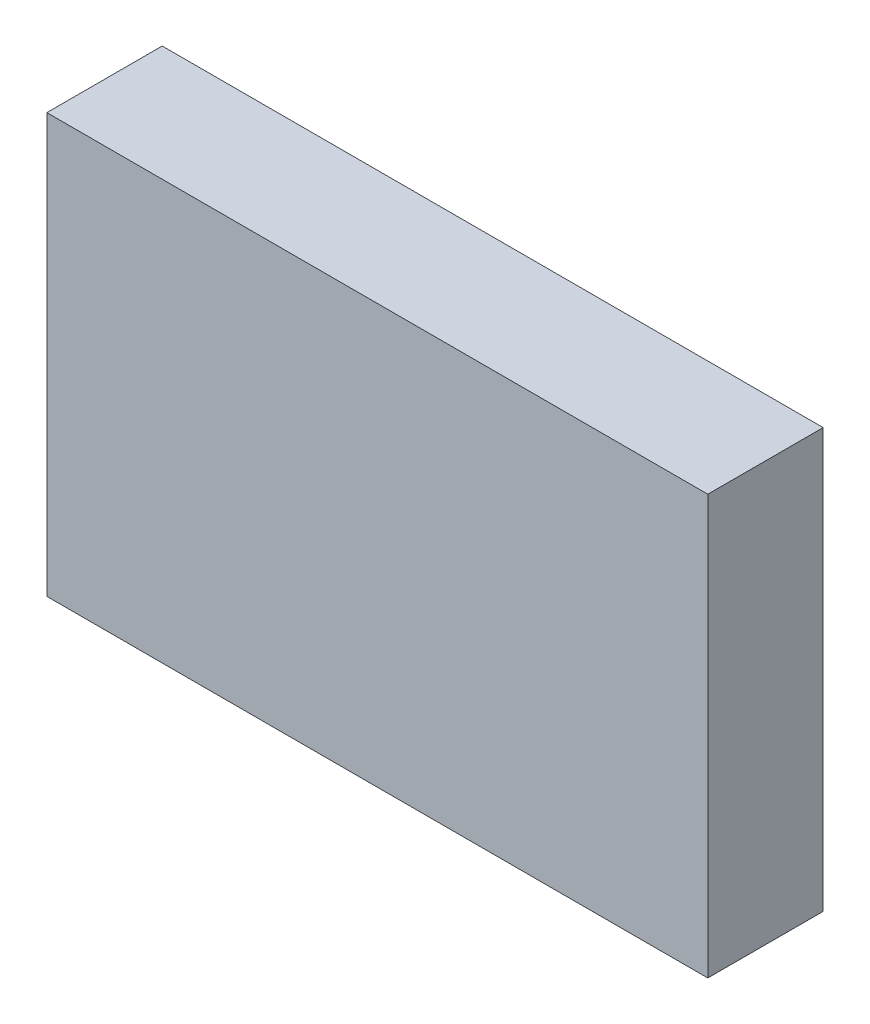
ISO-10303-21;
HEADER;
FILE_DESCRIPTION(('STEP AP214'),'2;1');
FILE_NAME('part.step','',(''),(''),'','','');
FILE_SCHEMA(('AUTOMOTIVE_DESIGN { 1 0 10303 214 1 1 1 1 }'));
ENDSEC;
DATA;
#1=APPLICATION_CONTEXT('core data for automotive mechanical design processes');
#2=APPLICATION_PROTOCOL_DEFINITION('international standard','automotive_design',2000,#1);
#3=PRODUCT_CONTEXT('',#1,'mechanical');
#4=PRODUCT('Part','Part','',(#3));
#5=PRODUCT_RELATED_PRODUCT_CATEGORY('part','',(#4));
#6=PRODUCT_DEFINITION_FORMATION('','',#4);
#7=PRODUCT_DEFINITION_CONTEXT('part definition',#1,'design');
#8=PRODUCT_DEFINITION('design','',#6,#7);
#9=PRODUCT_DEFINITION_SHAPE('','',#8);
#10=(LENGTH_UNIT() NAMED_UNIT(*) SI_UNIT(.MILLI.,.METRE.));
#11=(NAMED_UNIT(*) PLANE_ANGLE_UNIT() SI_UNIT($,.RADIAN.));
#12=(NAMED_UNIT(*) SI_UNIT($,.STERADIAN.) SOLID_ANGLE_UNIT());
#13=UNCERTAINTY_MEASURE_WITH_UNIT(LENGTH_MEASURE(1.E-05),#10,'distance_accuracy_value','');
#14=(GEOMETRIC_REPRESENTATION_CONTEXT(3) GLOBAL_UNCERTAINTY_ASSIGNED_CONTEXT((#13)) GLOBAL_UNIT_ASSIGNED_CONTEXT((#10,
#11,#12)) REPRESENTATION_CONTEXT('',''));
#15=CARTESIAN_POINT('',(0.,0.,0.));
#16=DIRECTION('',(0.,0.,1.));
#17=DIRECTION('',(1.,0.,0.));
#18=AXIS2_PLACEMENT_3D('',#15,#16,#17);
#19=CARTESIAN_POINT('',(7.62634736702007,17.020510715502,1.7018));
#20=DIRECTION('',(-1.,0.,0.));
#21=DIRECTION('',(0.,0.,1.));
#22=AXIS2_PLACEMENT_3D('',#19,#20,#21);
#23=PLANE('',#22);
#24=DIRECTION('',(0.,1.,0.));
#25=VECTOR('',#24,1.);
#26=CARTESIAN_POINT('',(7.62634736702007,16.294183696783,1.7018));
#27=LINE('',#26,#25);
#28=CARTESIAN_POINT('',(7.62634736702007,16.294183696783,1.7018));
#29=VERTEX_POINT('',#28);
#30=CARTESIAN_POINT('',(7.62634736702007,17.020510715502,1.7018));
#31=VERTEX_POINT('',#30);
#32=EDGE_CURVE('E95',#29,#31,#27,.T.);
#33=ORIENTED_EDGE('',*,*,#32,.F.);
#34=DIRECTION('',(0.,0.,1.));
#35=VECTOR('',#34,1.);
#36=CARTESIAN_POINT('',(7.62634736702007,16.294183696783,1.7018));
#37=LINE('',#36,#35);
#38=CARTESIAN_POINT('',(7.62634736702007,16.294183696783,1.9018));
#39=VERTEX_POINT('',#38);
#40=EDGE_CURVE('E65',#29,#39,#37,.T.);
#41=ORIENTED_EDGE('',*,*,#40,.T.);
#42=DIRECTION('',(0.,-1.,0.));
#43=VECTOR('',#42,1.);
#44=CARTESIAN_POINT('',(7.62634736702007,16.294183696783,1.9018));
#45=LINE('',#44,#43);
#46=CARTESIAN_POINT('',(7.62634736702007,17.020510715502,1.9018));
#47=VERTEX_POINT('',#46);
#48=EDGE_CURVE('E83',#47,#39,#45,.T.);
#49=ORIENTED_EDGE('',*,*,#48,.F.);
#50=DIRECTION('',(0.,0.,1.));
#51=VECTOR('',#50,1.);
#52=CARTESIAN_POINT('',(7.62634736702007,17.020510715502,1.7018));
#53=LINE('',#52,#51);
#54=EDGE_CURVE('E11',#31,#47,#53,.T.);
#55=ORIENTED_EDGE('',*,*,#54,.F.);
#56=EDGE_LOOP('',(#33,#41,#49,#55));
#57=FACE_BOUND('',#56,.T.);
#58=ADVANCED_FACE('F16',(#57),#23,.T.);
#59=CARTESIAN_POINT('',(8.77214765628232,17.020510715502,1.7018));
#60=DIRECTION('',(0.,1.,0.));
#61=DIRECTION('',(1.,0.,0.));
#62=AXIS2_PLACEMENT_3D('',#59,#60,#61);
#63=PLANE('',#62);
#64=DIRECTION('',(1.,0.,0.));
#65=VECTOR('',#64,1.);
#66=CARTESIAN_POINT('',(7.62634736702007,17.020510715502,1.7018));
#67=LINE('',#66,#65);
#68=CARTESIAN_POINT('',(8.77214765628232,17.020510715502,1.7018));
#69=VERTEX_POINT('',#68);
#70=EDGE_CURVE('E89',#31,#69,#67,.T.);
#71=ORIENTED_EDGE('',*,*,#70,.F.);
#72=ORIENTED_EDGE('',*,*,#54,.T.);
#73=DIRECTION('',(-1.,0.,0.));
#74=VECTOR('',#73,1.);
#75=CARTESIAN_POINT('',(7.62634736702007,17.020510715502,1.9018));
#76=LINE('',#75,#74);
#77=CARTESIAN_POINT('',(8.77214765628232,17.020510715502,1.9018));
#78=VERTEX_POINT('',#77);
#79=EDGE_CURVE('E20',#78,#47,#76,.T.);
#80=ORIENTED_EDGE('',*,*,#79,.F.);
#81=DIRECTION('',(0.,0.,1.));
#82=VECTOR('',#81,1.);
#83=CARTESIAN_POINT('',(8.77214765628232,17.020510715502,1.7018));
#84=LINE('',#83,#82);
#85=EDGE_CURVE('E27',#69,#78,#84,.T.);
#86=ORIENTED_EDGE('',*,*,#85,.F.);
#87=EDGE_LOOP('',(#71,#72,#80,#86));
#88=FACE_BOUND('',#87,.T.);
#89=ADVANCED_FACE('F122',(#88),#63,.T.);
#90=CARTESIAN_POINT('',(8.77214765628232,16.294183696783,1.7018));
#91=DIRECTION('',(1.,0.,0.));
#92=DIRECTION('',(0.,1.,0.));
#93=AXIS2_PLACEMENT_3D('',#90,#91,#92);
#94=PLANE('',#93);
#95=DIRECTION('',(0.,-1.,0.));
#96=VECTOR('',#95,1.);
#97=CARTESIAN_POINT('',(8.77214765628232,17.020510715502,1.7018));
#98=LINE('',#97,#96);
#99=CARTESIAN_POINT('',(8.77214765628232,16.294183696783,1.7018));
#100=VERTEX_POINT('',#99);
#101=EDGE_CURVE('E77',#69,#100,#98,.T.);
#102=ORIENTED_EDGE('',*,*,#101,.F.);
#103=ORIENTED_EDGE('',*,*,#85,.T.);
#104=DIRECTION('',(0.,1.,0.));
#105=VECTOR('',#104,1.);
#106=CARTESIAN_POINT('',(8.77214765628232,17.020510715502,1.9018));
#107=LINE('',#106,#105);
#108=CARTESIAN_POINT('',(8.77214765628232,16.294183696783,1.9018));
#109=VERTEX_POINT('',#108);
#110=EDGE_CURVE('E80',#109,#78,#107,.T.);
#111=ORIENTED_EDGE('',*,*,#110,.F.);
#112=DIRECTION('',(0.,0.,1.));
#113=VECTOR('',#112,1.);
#114=CARTESIAN_POINT('',(8.77214765628232,16.294183696783,1.7018));
#115=LINE('',#114,#113);
#116=EDGE_CURVE('E74',#100,#109,#115,.T.);
#117=ORIENTED_EDGE('',*,*,#116,.F.);
#118=EDGE_LOOP('',(#102,#103,#111,#117));
#119=FACE_BOUND('',#118,.T.);
#120=ADVANCED_FACE('F76',(#119),#94,.T.);
#121=CARTESIAN_POINT('',(7.62634736702007,16.294183696783,1.7018));
#122=DIRECTION('',(0.,-1.,0.));
#123=DIRECTION('',(0.,0.,-1.));
#124=AXIS2_PLACEMENT_3D('',#121,#122,#123);
#125=PLANE('',#124);
#126=DIRECTION('',(-1.,0.,0.));
#127=VECTOR('',#126,1.);
#128=CARTESIAN_POINT('',(8.77214765628232,16.294183696783,1.7018));
#129=LINE('',#128,#127);
#130=EDGE_CURVE('E88',#100,#29,#129,.T.);
#131=ORIENTED_EDGE('',*,*,#130,.F.);
#132=ORIENTED_EDGE('',*,*,#116,.T.);
#133=DIRECTION('',(1.,0.,0.));
#134=VECTOR('',#133,1.);
#135=CARTESIAN_POINT('',(8.77214765628232,16.294183696783,1.9018));
#136=LINE('',#135,#134);
#137=EDGE_CURVE('E91',#39,#109,#136,.T.);
#138=ORIENTED_EDGE('',*,*,#137,.F.);
#139=ORIENTED_EDGE('',*,*,#40,.F.);
#140=EDGE_LOOP('',(#131,#132,#138,#139));
#141=FACE_BOUND('',#140,.T.);
#142=ADVANCED_FACE('F93',(#141),#125,.T.);
#143=CARTESIAN_POINT('',(8.1992475116512,16.6573472061425,1.9018));
#144=DIRECTION('',(0.,0.,1.));
#145=DIRECTION('',(1.,0.,0.));
#146=AXIS2_PLACEMENT_3D('',#143,#144,#145);
#147=PLANE('',#146);
#148=ORIENTED_EDGE('',*,*,#137,.T.);
#149=ORIENTED_EDGE('',*,*,#110,.T.);
#150=ORIENTED_EDGE('',*,*,#79,.T.);
#151=ORIENTED_EDGE('',*,*,#48,.T.);
#152=EDGE_LOOP('',(#148,#149,#150,#151));
#153=FACE_BOUND('',#152,.T.);
#154=ADVANCED_FACE('F121',(#153),#147,.T.);
#155=CARTESIAN_POINT('',(8.1992475116512,16.6573472061425,1.7018));
#156=DIRECTION('',(0.,0.,1.));
#157=DIRECTION('',(1.,0.,0.));
#158=AXIS2_PLACEMENT_3D('',#155,#156,#157);
#159=PLANE('',#158);
#160=ORIENTED_EDGE('',*,*,#130,.T.);
#161=ORIENTED_EDGE('',*,*,#32,.T.);
#162=ORIENTED_EDGE('',*,*,#70,.T.);
#163=ORIENTED_EDGE('',*,*,#101,.T.);
#164=EDGE_LOOP('',(#160,#161,#162,#163));
#165=FACE_BOUND('',#164,.T.);
#166=ADVANCED_FACE('F18',(#165),#159,.F.);
#167=CLOSED_SHELL('',(#58,#89,#120,#142,#154,#166));
#168=MANIFOLD_SOLID_BREP('B1',#167);
#169=ADVANCED_BREP_SHAPE_REPRESENTATION('',(#18,#168),#14);
#170=SHAPE_DEFINITION_REPRESENTATION(#9,#169);
ENDSEC;
END-ISO-10303-21;
